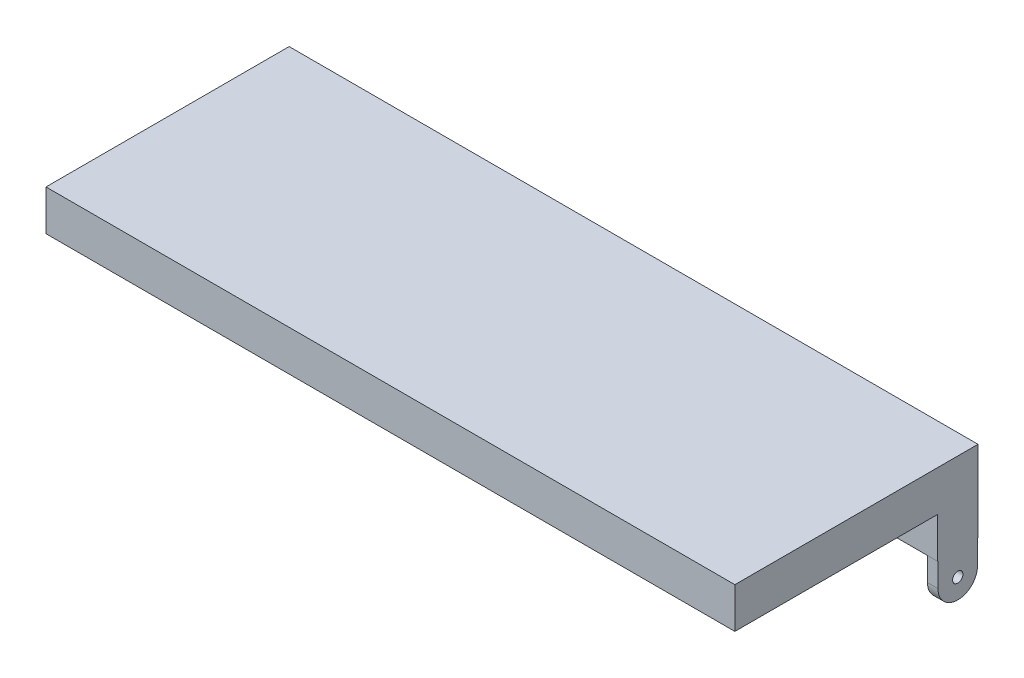
ISO-10303-21;
HEADER;
FILE_DESCRIPTION(('STEP AP214'),'2;1');
FILE_NAME('part.step','',(''),(''),'','','');
FILE_SCHEMA(('AUTOMOTIVE_DESIGN { 1 0 10303 214 1 1 1 1 }'));
ENDSEC;
DATA;
#1=APPLICATION_CONTEXT('core data for automotive mechanical design processes');
#2=APPLICATION_PROTOCOL_DEFINITION('international standard','automotive_design',2000,#1);
#3=PRODUCT_CONTEXT('',#1,'mechanical');
#4=PRODUCT('Part','Part','',(#3));
#5=PRODUCT_RELATED_PRODUCT_CATEGORY('part','',(#4));
#6=PRODUCT_DEFINITION_FORMATION('','',#4);
#7=PRODUCT_DEFINITION_CONTEXT('part definition',#1,'design');
#8=PRODUCT_DEFINITION('design','',#6,#7);
#9=PRODUCT_DEFINITION_SHAPE('','',#8);
#10=(LENGTH_UNIT() NAMED_UNIT(*) SI_UNIT(.MILLI.,.METRE.));
#11=(NAMED_UNIT(*) PLANE_ANGLE_UNIT() SI_UNIT($,.RADIAN.));
#12=(NAMED_UNIT(*) SI_UNIT($,.STERADIAN.) SOLID_ANGLE_UNIT());
#13=UNCERTAINTY_MEASURE_WITH_UNIT(LENGTH_MEASURE(1.E-05),#10,'distance_accuracy_value','');
#14=(GEOMETRIC_REPRESENTATION_CONTEXT(3) GLOBAL_UNCERTAINTY_ASSIGNED_CONTEXT((#13)) GLOBAL_UNIT_ASSIGNED_CONTEXT((#10,
#11,#12)) REPRESENTATION_CONTEXT('',''));
#15=CARTESIAN_POINT('',(0.,0.,0.));
#16=DIRECTION('',(0.,0.,1.));
#17=DIRECTION('',(1.,0.,0.));
#18=AXIS2_PLACEMENT_3D('',#15,#16,#17);
#19=CARTESIAN_POINT('',(0.,9.98482723381414,0.));
#20=DIRECTION('',(0.,-1.,0.));
#21=DIRECTION('',(0.,0.,-1.));
#22=AXIS2_PLACEMENT_3D('',#19,#20,#21);
#23=PLANE('',#22);
#24=DIRECTION('',(0.,0.,-1.));
#25=VECTOR('',#24,1.);
#26=CARTESIAN_POINT('',(85.,9.98482723381414,0.));
#27=LINE('',#26,#25);
#28=CARTESIAN_POINT('',(85.,9.98482723381414,-29.94));
#29=VERTEX_POINT('',#28);
#30=CARTESIAN_POINT('',(85.,9.98482723381414,-30.));
#31=VERTEX_POINT('',#30);
#32=EDGE_CURVE('E60',#29,#31,#27,.T.);
#33=ORIENTED_EDGE('',*,*,#32,.F.);
#34=DIRECTION('',(-1.,0.,0.));
#35=VECTOR('',#34,1.);
#36=CARTESIAN_POINT('',(85.,9.98482723381414,-29.94));
#37=LINE('',#36,#35);
#38=CARTESIAN_POINT('',(83.7,9.98482723381414,-29.94));
#39=VERTEX_POINT('',#38);
#40=EDGE_CURVE('E184',#29,#39,#37,.T.);
#41=ORIENTED_EDGE('',*,*,#40,.T.);
#42=DIRECTION('',(0.,0.,1.));
#43=VECTOR('',#42,1.);
#44=CARTESIAN_POINT('',(83.7,9.98482723381414,0.));
#45=LINE('',#44,#43);
#46=CARTESIAN_POINT('',(83.7,9.98482723381414,-25.06));
#47=VERTEX_POINT('',#46);
#48=EDGE_CURVE('E54',#39,#47,#45,.T.);
#49=ORIENTED_EDGE('',*,*,#48,.T.);
#50=DIRECTION('',(-1.,0.,0.));
#51=VECTOR('',#50,1.);
#52=CARTESIAN_POINT('',(85.,9.98482723381414,-25.06));
#53=LINE('',#52,#51);
#54=CARTESIAN_POINT('',(85.,9.98482723381414,-25.06));
#55=VERTEX_POINT('',#54);
#56=EDGE_CURVE('E149',#55,#47,#53,.T.);
#57=ORIENTED_EDGE('',*,*,#56,.F.);
#58=CARTESIAN_POINT('',(85.,9.98482723381414,-25.));
#59=VERTEX_POINT('',#58);
#60=EDGE_CURVE('E161',#59,#55,#27,.T.);
#61=ORIENTED_EDGE('',*,*,#60,.F.);
#62=DIRECTION('',(-1.,0.,0.));
#63=VECTOR('',#62,1.);
#64=CARTESIAN_POINT('',(85.,9.98482723381414,-25.));
#65=LINE('',#64,#63);
#66=CARTESIAN_POINT('',(0.,9.98482723381414,-25.));
#67=VERTEX_POINT('',#66);
#68=EDGE_CURVE('E230',#59,#67,#65,.T.);
#69=ORIENTED_EDGE('',*,*,#68,.T.);
#70=DIRECTION('',(0.,0.,1.));
#71=VECTOR('',#70,1.);
#72=CARTESIAN_POINT('',(0.,9.98482723381414,0.));
#73=LINE('',#72,#71);
#74=CARTESIAN_POINT('',(0.,9.98482723381414,-25.06));
#75=VERTEX_POINT('',#74);
#76=EDGE_CURVE('E233',#75,#67,#73,.T.);
#77=ORIENTED_EDGE('',*,*,#76,.F.);
#78=DIRECTION('',(-1.,0.,0.));
#79=VECTOR('',#78,1.);
#80=CARTESIAN_POINT('',(1.3,9.98482723381414,-25.06));
#81=LINE('',#80,#79);
#82=CARTESIAN_POINT('',(1.3,9.98482723381414,-25.06));
#83=VERTEX_POINT('',#82);
#84=EDGE_CURVE('E217',#83,#75,#81,.T.);
#85=ORIENTED_EDGE('',*,*,#84,.F.);
#86=DIRECTION('',(0.,0.,1.));
#87=VECTOR('',#86,1.);
#88=CARTESIAN_POINT('',(1.3,9.98482723381414,0.));
#89=LINE('',#88,#87);
#90=CARTESIAN_POINT('',(1.3,9.98482723381414,-29.94));
#91=VERTEX_POINT('',#90);
#92=EDGE_CURVE('E197',#91,#83,#89,.T.);
#93=ORIENTED_EDGE('',*,*,#92,.F.);
#94=DIRECTION('',(-1.,0.,0.));
#95=VECTOR('',#94,1.);
#96=CARTESIAN_POINT('',(1.3,9.98482723381414,-29.94));
#97=LINE('',#96,#95);
#98=CARTESIAN_POINT('',(0.,9.98482723381414,-29.94));
#99=VERTEX_POINT('',#98);
#100=EDGE_CURVE('E214',#91,#99,#97,.T.);
#101=ORIENTED_EDGE('',*,*,#100,.T.);
#102=CARTESIAN_POINT('',(0.,9.98482723381414,-30.));
#103=VERTEX_POINT('',#102);
#104=EDGE_CURVE('E248',#103,#99,#73,.T.);
#105=ORIENTED_EDGE('',*,*,#104,.F.);
#106=DIRECTION('',(-1.,0.,0.));
#107=VECTOR('',#106,1.);
#108=CARTESIAN_POINT('',(0.,9.98482723381414,-30.));
#109=LINE('',#108,#107);
#110=EDGE_CURVE('E241',#31,#103,#109,.T.);
#111=ORIENTED_EDGE('',*,*,#110,.F.);
#112=EDGE_LOOP('',(#33,#41,#49,#57,#61,#69,#77,#85,#93,#101,#105,#111));
#113=FACE_BOUND('',#112,.T.);
#114=ADVANCED_FACE('F39',(#113),#23,.T.);
#115=CARTESIAN_POINT('',(0.,19.9848272338141,0.));
#116=DIRECTION('',(1.,0.,0.));
#117=DIRECTION('',(0.,0.,-1.));
#118=AXIS2_PLACEMENT_3D('',#115,#116,#117);
#119=PLANE('',#118);
#120=ORIENTED_EDGE('',*,*,#104,.T.);
#121=DIRECTION('',(0.,1.,0.));
#122=VECTOR('',#121,1.);
#123=CARTESIAN_POINT('',(0.,0.,-29.94));
#124=LINE('',#123,#122);
#125=CARTESIAN_POINT('',(0.,7.03482723381414,-29.94));
#126=VERTEX_POINT('',#125);
#127=EDGE_CURVE('E191',#126,#99,#124,.T.);
#128=ORIENTED_EDGE('',*,*,#127,.F.);
#129=CARTESIAN_POINT('',(0.,7.03482723381414,-27.5));
#130=DIRECTION('',(-1.,0.,0.));
#131=DIRECTION('',(0.,0.,1.));
#132=AXIS2_PLACEMENT_3D('',#129,#130,#131);
#133=CIRCLE('',#132,2.44);
#134=CARTESIAN_POINT('',(0.,7.03482723381414,-25.06));
#135=VERTEX_POINT('',#134);
#136=EDGE_CURVE('E204',#126,#135,#133,.T.);
#137=ORIENTED_EDGE('',*,*,#136,.T.);
#138=DIRECTION('',(0.,1.,0.));
#139=VECTOR('',#138,1.);
#140=CARTESIAN_POINT('',(0.,0.,-25.06));
#141=LINE('',#140,#139);
#142=EDGE_CURVE('E207',#135,#75,#141,.T.);
#143=ORIENTED_EDGE('',*,*,#142,.T.);
#144=ORIENTED_EDGE('',*,*,#76,.T.);
#145=DIRECTION('',(0.,-1.,0.));
#146=VECTOR('',#145,1.);
#147=CARTESIAN_POINT('',(0.,9.98482723381414,-25.));
#148=LINE('',#147,#146);
#149=CARTESIAN_POINT('',(0.,14.9848272338141,-25.));
#150=VERTEX_POINT('',#149);
#151=EDGE_CURVE('E223',#150,#67,#148,.T.);
#152=ORIENTED_EDGE('',*,*,#151,.F.);
#153=DIRECTION('',(0.,0.,-1.));
#154=VECTOR('',#153,1.);
#155=CARTESIAN_POINT('',(0.,14.9848272338141,0.));
#156=LINE('',#155,#154);
#157=CARTESIAN_POINT('',(0.,14.9848272338141,0.));
#158=VERTEX_POINT('',#157);
#159=EDGE_CURVE('E213',#158,#150,#156,.T.);
#160=ORIENTED_EDGE('',*,*,#159,.F.);
#161=DIRECTION('',(0.,-1.,0.));
#162=VECTOR('',#161,1.);
#163=CARTESIAN_POINT('',(0.,19.9848272338141,0.));
#164=LINE('',#163,#162);
#165=CARTESIAN_POINT('',(0.,19.9848272338141,0.));
#166=VERTEX_POINT('',#165);
#167=EDGE_CURVE('E11',#166,#158,#164,.T.);
#168=ORIENTED_EDGE('',*,*,#167,.F.);
#169=DIRECTION('',(0.,0.,1.));
#170=VECTOR('',#169,1.);
#171=CARTESIAN_POINT('',(0.,19.9848272338141,0.));
#172=LINE('',#171,#170);
#173=CARTESIAN_POINT('',(0.,19.9848272338141,-30.));
#174=VERTEX_POINT('',#173);
#175=EDGE_CURVE('E237',#174,#166,#172,.T.);
#176=ORIENTED_EDGE('',*,*,#175,.F.);
#177=DIRECTION('',(0.,-1.,0.));
#178=VECTOR('',#177,1.);
#179=CARTESIAN_POINT('',(0.,19.9848272338141,-30.));
#180=LINE('',#179,#178);
#181=EDGE_CURVE('E247',#174,#103,#180,.T.);
#182=ORIENTED_EDGE('',*,*,#181,.T.);
#183=EDGE_LOOP('',(#120,#128,#137,#143,#144,#152,#160,#168,#176,#182));
#184=FACE_BOUND('',#183,.T.);
#185=CARTESIAN_POINT('',(0.,7.03482723381414,-27.5));
#186=DIRECTION('',(-1.,0.,0.));
#187=DIRECTION('',(0.,0.,1.));
#188=AXIS2_PLACEMENT_3D('',#185,#186,#187);
#189=CIRCLE('',#188,0.640000000000001);
#190=CARTESIAN_POINT('',(0.,7.03482723381414,-26.86));
#191=VERTEX_POINT('',#190);
#192=EDGE_CURVE('E183',#191,#191,#189,.T.);
#193=ORIENTED_EDGE('',*,*,#192,.F.);
#194=EDGE_LOOP('',(#193));
#195=FACE_BOUND('',#194,.T.);
#196=ADVANCED_FACE('F41',(#184,#195),#119,.F.);
#197=CARTESIAN_POINT('',(0.,19.9848272338141,0.));
#198=DIRECTION('',(0.,0.,-1.));
#199=DIRECTION('',(-1.,0.,0.));
#200=AXIS2_PLACEMENT_3D('',#197,#198,#199);
#201=PLANE('',#200);
#202=ORIENTED_EDGE('',*,*,#167,.T.);
#203=DIRECTION('',(-1.,0.,0.));
#204=VECTOR('',#203,1.);
#205=CARTESIAN_POINT('',(85.,14.9848272338141,0.));
#206=LINE('',#205,#204);
#207=CARTESIAN_POINT('',(85.,14.9848272338141,0.));
#208=VERTEX_POINT('',#207);
#209=EDGE_CURVE('E225',#208,#158,#206,.T.);
#210=ORIENTED_EDGE('',*,*,#209,.F.);
#211=DIRECTION('',(0.,-1.,0.));
#212=VECTOR('',#211,1.);
#213=CARTESIAN_POINT('',(85.,19.9848272338141,0.));
#214=LINE('',#213,#212);
#215=CARTESIAN_POINT('',(85.,19.9848272338141,0.));
#216=VERTEX_POINT('',#215);
#217=EDGE_CURVE('E47',#216,#208,#214,.T.);
#218=ORIENTED_EDGE('',*,*,#217,.F.);
#219=DIRECTION('',(1.,0.,0.));
#220=VECTOR('',#219,1.);
#221=CARTESIAN_POINT('',(0.,19.9848272338141,0.));
#222=LINE('',#221,#220);
#223=EDGE_CURVE('E240',#166,#216,#222,.T.);
#224=ORIENTED_EDGE('',*,*,#223,.F.);
#225=EDGE_LOOP('',(#202,#210,#218,#224));
#226=FACE_BOUND('',#225,.T.);
#227=ADVANCED_FACE('F263',(#226),#201,.F.);
#228=CARTESIAN_POINT('',(85.,19.9848272338141,0.));
#229=DIRECTION('',(-1.,0.,0.));
#230=DIRECTION('',(0.,0.,1.));
#231=AXIS2_PLACEMENT_3D('',#228,#229,#230);
#232=PLANE('',#231);
#233=DIRECTION('',(0.,0.,-1.));
#234=VECTOR('',#233,1.);
#235=CARTESIAN_POINT('',(85.,14.9848272338141,0.));
#236=LINE('',#235,#234);
#237=CARTESIAN_POINT('',(85.,14.9848272338141,-25.));
#238=VERTEX_POINT('',#237);
#239=EDGE_CURVE('E220',#208,#238,#236,.T.);
#240=ORIENTED_EDGE('',*,*,#239,.T.);
#241=DIRECTION('',(0.,-1.,0.));
#242=VECTOR('',#241,1.);
#243=CARTESIAN_POINT('',(85.,9.98482723381414,-25.));
#244=LINE('',#243,#242);
#245=EDGE_CURVE('E222',#238,#59,#244,.T.);
#246=ORIENTED_EDGE('',*,*,#245,.T.);
#247=ORIENTED_EDGE('',*,*,#60,.T.);
#248=DIRECTION('',(0.,1.,0.));
#249=VECTOR('',#248,1.);
#250=CARTESIAN_POINT('',(85.,0.,-25.06));
#251=LINE('',#250,#249);
#252=CARTESIAN_POINT('',(85.,7.03482723381414,-25.06));
#253=VERTEX_POINT('',#252);
#254=EDGE_CURVE('E142',#253,#55,#251,.T.);
#255=ORIENTED_EDGE('',*,*,#254,.F.);
#256=CARTESIAN_POINT('',(85.,7.03482723381414,-27.5));
#257=DIRECTION('',(-1.,0.,0.));
#258=DIRECTION('',(0.,0.,1.));
#259=AXIS2_PLACEMENT_3D('',#256,#257,#258);
#260=CIRCLE('',#259,2.44);
#261=CARTESIAN_POINT('',(85.,7.03482723381414,-29.94));
#262=VERTEX_POINT('',#261);
#263=EDGE_CURVE('E158',#262,#253,#260,.T.);
#264=ORIENTED_EDGE('',*,*,#263,.F.);
#265=DIRECTION('',(0.,1.,0.));
#266=VECTOR('',#265,1.);
#267=CARTESIAN_POINT('',(85.,0.,-29.94));
#268=LINE('',#267,#266);
#269=EDGE_CURVE('E150',#262,#29,#268,.T.);
#270=ORIENTED_EDGE('',*,*,#269,.T.);
#271=ORIENTED_EDGE('',*,*,#32,.T.);
#272=DIRECTION('',(0.,-1.,0.));
#273=VECTOR('',#272,1.);
#274=CARTESIAN_POINT('',(85.,19.9848272338141,-30.));
#275=LINE('',#274,#273);
#276=CARTESIAN_POINT('',(85.,19.9848272338141,-30.));
#277=VERTEX_POINT('',#276);
#278=EDGE_CURVE('E255',#277,#31,#275,.T.);
#279=ORIENTED_EDGE('',*,*,#278,.F.);
#280=DIRECTION('',(0.,0.,-1.));
#281=VECTOR('',#280,1.);
#282=CARTESIAN_POINT('',(85.,19.9848272338141,0.));
#283=LINE('',#282,#281);
#284=EDGE_CURVE('E243',#216,#277,#283,.T.);
#285=ORIENTED_EDGE('',*,*,#284,.F.);
#286=ORIENTED_EDGE('',*,*,#217,.T.);
#287=EDGE_LOOP('',(#240,#246,#247,#255,#264,#270,#271,#279,#285,#286));
#288=FACE_BOUND('',#287,.T.);
#289=CARTESIAN_POINT('',(85.,7.03482723381414,-27.5));
#290=DIRECTION('',(-1.,0.,0.));
#291=DIRECTION('',(0.,0.,1.));
#292=AXIS2_PLACEMENT_3D('',#289,#290,#291);
#293=CIRCLE('',#292,0.640000000000001);
#294=CARTESIAN_POINT('',(85.,7.03482723381414,-26.86));
#295=VERTEX_POINT('',#294);
#296=EDGE_CURVE('E166',#295,#295,#293,.T.);
#297=ORIENTED_EDGE('',*,*,#296,.T.);
#298=EDGE_LOOP('',(#297));
#299=FACE_BOUND('',#298,.T.);
#300=ADVANCED_FACE('F156',(#288,#299),#232,.F.);
#301=CARTESIAN_POINT('',(0.,19.9848272338141,-30.));
#302=DIRECTION('',(0.,0.,1.));
#303=DIRECTION('',(1.,0.,0.));
#304=AXIS2_PLACEMENT_3D('',#301,#302,#303);
#305=PLANE('',#304);
#306=ORIENTED_EDGE('',*,*,#110,.T.);
#307=ORIENTED_EDGE('',*,*,#181,.F.);
#308=DIRECTION('',(-1.,0.,0.));
#309=VECTOR('',#308,1.);
#310=CARTESIAN_POINT('',(0.,19.9848272338141,-30.));
#311=LINE('',#310,#309);
#312=EDGE_CURVE('E245',#277,#174,#311,.T.);
#313=ORIENTED_EDGE('',*,*,#312,.F.);
#314=ORIENTED_EDGE('',*,*,#278,.T.);
#315=EDGE_LOOP('',(#306,#307,#313,#314));
#316=FACE_BOUND('',#315,.T.);
#317=ADVANCED_FACE('F285',(#316),#305,.F.);
#318=CARTESIAN_POINT('',(0.,19.9848272338141,0.));
#319=DIRECTION('',(0.,-1.,0.));
#320=DIRECTION('',(0.,0.,-1.));
#321=AXIS2_PLACEMENT_3D('',#318,#319,#320);
#322=PLANE('',#321);
#323=ORIENTED_EDGE('',*,*,#175,.T.);
#324=ORIENTED_EDGE('',*,*,#223,.T.);
#325=ORIENTED_EDGE('',*,*,#284,.T.);
#326=ORIENTED_EDGE('',*,*,#312,.T.);
#327=EDGE_LOOP('',(#323,#324,#325,#326));
#328=FACE_BOUND('',#327,.T.);
#329=ADVANCED_FACE('F293',(#328),#322,.F.);
#330=CARTESIAN_POINT('',(85.,9.98482723381414,-25.));
#331=DIRECTION('',(0.,0.,-1.));
#332=DIRECTION('',(-1.,0.,0.));
#333=AXIS2_PLACEMENT_3D('',#330,#331,#332);
#334=PLANE('',#333);
#335=ORIENTED_EDGE('',*,*,#151,.T.);
#336=ORIENTED_EDGE('',*,*,#68,.F.);
#337=ORIENTED_EDGE('',*,*,#245,.F.);
#338=DIRECTION('',(-1.,0.,0.));
#339=VECTOR('',#338,1.);
#340=CARTESIAN_POINT('',(85.,14.9848272338141,-25.));
#341=LINE('',#340,#339);
#342=EDGE_CURVE('E234',#238,#150,#341,.T.);
#343=ORIENTED_EDGE('',*,*,#342,.T.);
#344=EDGE_LOOP('',(#335,#336,#337,#343));
#345=FACE_BOUND('',#344,.T.);
#346=ADVANCED_FACE('F274',(#345),#334,.F.);
#347=CARTESIAN_POINT('',(85.,14.9848272338141,0.));
#348=DIRECTION('',(0.,1.,0.));
#349=DIRECTION('',(0.,0.,1.));
#350=AXIS2_PLACEMENT_3D('',#347,#348,#349);
#351=PLANE('',#350);
#352=ORIENTED_EDGE('',*,*,#159,.T.);
#353=ORIENTED_EDGE('',*,*,#342,.F.);
#354=ORIENTED_EDGE('',*,*,#239,.F.);
#355=ORIENTED_EDGE('',*,*,#209,.T.);
#356=EDGE_LOOP('',(#352,#353,#354,#355));
#357=FACE_BOUND('',#356,.T.);
#358=ADVANCED_FACE('F267',(#357),#351,.F.);
#359=CARTESIAN_POINT('',(1.3,7.03482723381414,-27.5));
#360=DIRECTION('',(-1.,0.,0.));
#361=DIRECTION('',(0.,0.,1.));
#362=AXIS2_PLACEMENT_3D('',#359,#360,#361);
#363=CYLINDRICAL_SURFACE('',#362,2.44);
#364=ORIENTED_EDGE('',*,*,#136,.F.);
#365=DIRECTION('',(-1.,0.,0.));
#366=VECTOR('',#365,1.);
#367=CARTESIAN_POINT('',(1.3,7.03482723381414,-29.94));
#368=LINE('',#367,#366);
#369=CARTESIAN_POINT('',(1.3,7.03482723381414,-29.94));
#370=VERTEX_POINT('',#369);
#371=EDGE_CURVE('E211',#370,#126,#368,.T.);
#372=ORIENTED_EDGE('',*,*,#371,.F.);
#373=CARTESIAN_POINT('',(1.3,7.03482723381414,-27.5));
#374=DIRECTION('',(-1.,0.,0.));
#375=DIRECTION('',(0.,0.,1.));
#376=AXIS2_PLACEMENT_3D('',#373,#374,#375);
#377=CIRCLE('',#376,2.44);
#378=CARTESIAN_POINT('',(1.3,7.03482723381414,-25.06));
#379=VERTEX_POINT('',#378);
#380=EDGE_CURVE('E190',#370,#379,#377,.T.);
#381=ORIENTED_EDGE('',*,*,#380,.T.);
#382=DIRECTION('',(-1.,0.,0.));
#383=VECTOR('',#382,1.);
#384=CARTESIAN_POINT('',(1.3,7.03482723381414,-25.06));
#385=LINE('',#384,#383);
#386=EDGE_CURVE('E201',#379,#135,#385,.T.);
#387=ORIENTED_EDGE('',*,*,#386,.T.);
#388=EDGE_LOOP('',(#364,#372,#381,#387));
#389=FACE_BOUND('',#388,.T.);
#390=ADVANCED_FACE('F343',(#389),#363,.T.);
#391=CARTESIAN_POINT('',(1.3,0.,-29.94));
#392=DIRECTION('',(0.,0.,1.));
#393=DIRECTION('',(1.,0.,0.));
#394=AXIS2_PLACEMENT_3D('',#391,#392,#393);
#395=PLANE('',#394);
#396=ORIENTED_EDGE('',*,*,#127,.T.);
#397=ORIENTED_EDGE('',*,*,#100,.F.);
#398=DIRECTION('',(0.,1.,0.));
#399=VECTOR('',#398,1.);
#400=CARTESIAN_POINT('',(1.3,0.,-29.94));
#401=LINE('',#400,#399);
#402=EDGE_CURVE('E199',#370,#91,#401,.T.);
#403=ORIENTED_EDGE('',*,*,#402,.F.);
#404=ORIENTED_EDGE('',*,*,#371,.T.);
#405=EDGE_LOOP('',(#396,#397,#403,#404));
#406=FACE_BOUND('',#405,.T.);
#407=ADVANCED_FACE('F358',(#406),#395,.F.);
#408=CARTESIAN_POINT('',(1.3,7.03482723381414,-27.5));
#409=DIRECTION('',(-1.,0.,0.));
#410=DIRECTION('',(0.,0.,1.));
#411=AXIS2_PLACEMENT_3D('',#408,#409,#410);
#412=CYLINDRICAL_SURFACE('',#411,0.640000000000001);
#413=CARTESIAN_POINT('',(1.3,7.03482723381414,-27.5));
#414=DIRECTION('',(-1.,0.,0.));
#415=DIRECTION('',(0.,0.,1.));
#416=AXIS2_PLACEMENT_3D('',#413,#414,#415);
#417=CIRCLE('',#416,0.640000000000001);
#418=CARTESIAN_POINT('',(1.3,7.03482723381414,-26.86));
#419=VERTEX_POINT('',#418);
#420=EDGE_CURVE('E187',#419,#419,#417,.T.);
#421=ORIENTED_EDGE('',*,*,#420,.F.);
#422=EDGE_LOOP('',(#421));
#423=FACE_BOUND('',#422,.T.);
#424=ORIENTED_EDGE('',*,*,#192,.T.);
#425=EDGE_LOOP('',(#424));
#426=FACE_BOUND('',#425,.T.);
#427=ADVANCED_FACE('F368',(#423,#426),#412,.F.);
#428=CARTESIAN_POINT('',(1.3,0.,-25.06));
#429=DIRECTION('',(0.,0.,1.));
#430=DIRECTION('',(1.,0.,0.));
#431=AXIS2_PLACEMENT_3D('',#428,#429,#430);
#432=PLANE('',#431);
#433=ORIENTED_EDGE('',*,*,#142,.F.);
#434=ORIENTED_EDGE('',*,*,#386,.F.);
#435=DIRECTION('',(0.,1.,0.));
#436=VECTOR('',#435,1.);
#437=CARTESIAN_POINT('',(1.3,0.,-25.06));
#438=LINE('',#437,#436);
#439=EDGE_CURVE('E194',#379,#83,#438,.T.);
#440=ORIENTED_EDGE('',*,*,#439,.T.);
#441=ORIENTED_EDGE('',*,*,#84,.T.);
#442=EDGE_LOOP('',(#433,#434,#440,#441));
#443=FACE_BOUND('',#442,.T.);
#444=ADVANCED_FACE('F378',(#443),#432,.T.);
#445=CARTESIAN_POINT('',(1.3,0.,0.));
#446=DIRECTION('',(-1.,0.,0.));
#447=DIRECTION('',(0.,0.,1.));
#448=AXIS2_PLACEMENT_3D('',#445,#446,#447);
#449=PLANE('',#448);
#450=ORIENTED_EDGE('',*,*,#420,.T.);
#451=EDGE_LOOP('',(#450));
#452=FACE_BOUND('',#451,.T.);
#453=ORIENTED_EDGE('',*,*,#380,.F.);
#454=ORIENTED_EDGE('',*,*,#402,.T.);
#455=ORIENTED_EDGE('',*,*,#92,.T.);
#456=ORIENTED_EDGE('',*,*,#439,.F.);
#457=EDGE_LOOP('',(#453,#454,#455,#456));
#458=FACE_BOUND('',#457,.T.);
#459=ADVANCED_FACE('F388',(#452,#458),#449,.F.);
#460=CARTESIAN_POINT('',(85.,7.03482723381414,-27.5));
#461=DIRECTION('',(-1.,0.,0.));
#462=DIRECTION('',(0.,0.,1.));
#463=AXIS2_PLACEMENT_3D('',#460,#461,#462);
#464=CYLINDRICAL_SURFACE('',#463,2.44);
#465=CARTESIAN_POINT('',(83.7,7.03482723381414,-27.5));
#466=DIRECTION('',(-1.,0.,0.));
#467=DIRECTION('',(0.,0.,1.));
#468=AXIS2_PLACEMENT_3D('',#465,#466,#467);
#469=CIRCLE('',#468,2.44);
#470=CARTESIAN_POINT('',(83.7,7.03482723381414,-29.94));
#471=VERTEX_POINT('',#470);
#472=CARTESIAN_POINT('',(83.7,7.03482723381414,-25.06));
#473=VERTEX_POINT('',#472);
#474=EDGE_CURVE('E176',#471,#473,#469,.T.);
#475=ORIENTED_EDGE('',*,*,#474,.F.);
#476=DIRECTION('',(-1.,0.,0.));
#477=VECTOR('',#476,1.);
#478=CARTESIAN_POINT('',(85.,7.03482723381414,-29.94));
#479=LINE('',#478,#477);
#480=EDGE_CURVE('E164',#262,#471,#479,.T.);
#481=ORIENTED_EDGE('',*,*,#480,.F.);
#482=ORIENTED_EDGE('',*,*,#263,.T.);
#483=DIRECTION('',(-1.,0.,0.));
#484=VECTOR('',#483,1.);
#485=CARTESIAN_POINT('',(85.,7.03482723381414,-25.06));
#486=LINE('',#485,#484);
#487=EDGE_CURVE('E139',#253,#473,#486,.T.);
#488=ORIENTED_EDGE('',*,*,#487,.T.);
#489=EDGE_LOOP('',(#475,#481,#482,#488));
#490=FACE_BOUND('',#489,.T.);
#491=ADVANCED_FACE('F163',(#490),#464,.T.);
#492=CARTESIAN_POINT('',(85.,0.,-29.94));
#493=DIRECTION('',(0.,0.,1.));
#494=DIRECTION('',(1.,0.,0.));
#495=AXIS2_PLACEMENT_3D('',#492,#493,#494);
#496=PLANE('',#495);
#497=DIRECTION('',(0.,1.,0.));
#498=VECTOR('',#497,1.);
#499=CARTESIAN_POINT('',(83.7,0.,-29.94));
#500=LINE('',#499,#498);
#501=EDGE_CURVE('E169',#471,#39,#500,.T.);
#502=ORIENTED_EDGE('',*,*,#501,.T.);
#503=ORIENTED_EDGE('',*,*,#40,.F.);
#504=ORIENTED_EDGE('',*,*,#269,.F.);
#505=ORIENTED_EDGE('',*,*,#480,.T.);
#506=EDGE_LOOP('',(#502,#503,#504,#505));
#507=FACE_BOUND('',#506,.T.);
#508=ADVANCED_FACE('F282',(#507),#496,.F.);
#509=CARTESIAN_POINT('',(85.,7.03482723381414,-27.5));
#510=DIRECTION('',(-1.,0.,0.));
#511=DIRECTION('',(0.,0.,1.));
#512=AXIS2_PLACEMENT_3D('',#509,#510,#511);
#513=CYLINDRICAL_SURFACE('',#512,0.640000000000001);
#514=ORIENTED_EDGE('',*,*,#296,.F.);
#515=EDGE_LOOP('',(#514));
#516=FACE_BOUND('',#515,.T.);
#517=CARTESIAN_POINT('',(83.7,7.03482723381414,-27.5));
#518=DIRECTION('',(-1.,0.,0.));
#519=DIRECTION('',(0.,0.,1.));
#520=AXIS2_PLACEMENT_3D('',#517,#518,#519);
#521=CIRCLE('',#520,0.640000000000001);
#522=CARTESIAN_POINT('',(83.7,7.03482723381414,-26.86));
#523=VERTEX_POINT('',#522);
#524=EDGE_CURVE('E173',#523,#523,#521,.T.);
#525=ORIENTED_EDGE('',*,*,#524,.T.);
#526=EDGE_LOOP('',(#525));
#527=FACE_BOUND('',#526,.T.);
#528=ADVANCED_FACE('F431',(#516,#527),#513,.F.);
#529=CARTESIAN_POINT('',(85.,0.,-25.06));
#530=DIRECTION('',(0.,0.,1.));
#531=DIRECTION('',(1.,0.,0.));
#532=AXIS2_PLACEMENT_3D('',#529,#530,#531);
#533=PLANE('',#532);
#534=DIRECTION('',(0.,1.,0.));
#535=VECTOR('',#534,1.);
#536=CARTESIAN_POINT('',(83.7,0.,-25.06));
#537=LINE('',#536,#535);
#538=EDGE_CURVE('E144',#473,#47,#537,.T.);
#539=ORIENTED_EDGE('',*,*,#538,.F.);
#540=ORIENTED_EDGE('',*,*,#487,.F.);
#541=ORIENTED_EDGE('',*,*,#254,.T.);
#542=ORIENTED_EDGE('',*,*,#56,.T.);
#543=EDGE_LOOP('',(#539,#540,#541,#542));
#544=FACE_BOUND('',#543,.T.);
#545=ADVANCED_FACE('F141',(#544),#533,.T.);
#546=CARTESIAN_POINT('',(83.7,0.,0.));
#547=DIRECTION('',(-1.,0.,0.));
#548=DIRECTION('',(0.,0.,1.));
#549=AXIS2_PLACEMENT_3D('',#546,#547,#548);
#550=PLANE('',#549);
#551=ORIENTED_EDGE('',*,*,#524,.F.);
#552=EDGE_LOOP('',(#551));
#553=FACE_BOUND('',#552,.T.);
#554=ORIENTED_EDGE('',*,*,#474,.T.);
#555=ORIENTED_EDGE('',*,*,#538,.T.);
#556=ORIENTED_EDGE('',*,*,#48,.F.);
#557=ORIENTED_EDGE('',*,*,#501,.F.);
#558=EDGE_LOOP('',(#554,#555,#556,#557));
#559=FACE_BOUND('',#558,.T.);
#560=ADVANCED_FACE('F278',(#553,#559),#550,.T.);
#561=CLOSED_SHELL('',(#114,#196,#227,#300,#317,#329,#346,#358,#390,#407,#427,#444,#459,#491,
#508,#528,#545,#560));
#562=MANIFOLD_SOLID_BREP('B2',#561);
#563=ADVANCED_BREP_SHAPE_REPRESENTATION('',(#18,#562),#14);
#564=SHAPE_DEFINITION_REPRESENTATION(#9,#563);
ENDSEC;
END-ISO-10303-21;
